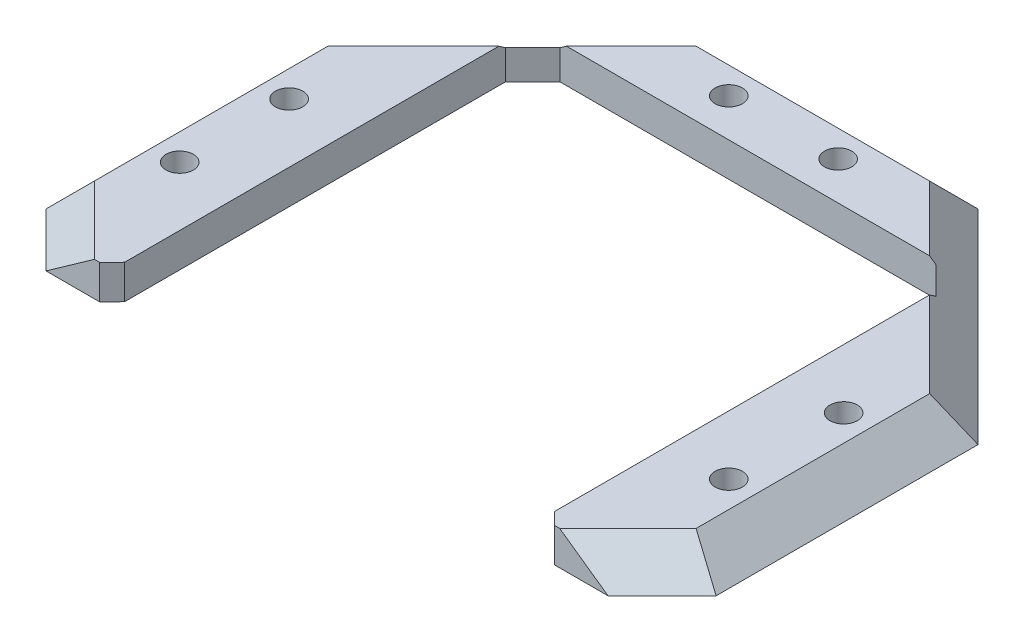
ISO-10303-21;
HEADER;
FILE_DESCRIPTION(('STEP AP214'),'2;1');
FILE_NAME('part.step','',(''),(''),'','','');
FILE_SCHEMA(('AUTOMOTIVE_DESIGN { 1 0 10303 214 1 1 1 1 }'));
ENDSEC;
DATA;
#1=APPLICATION_CONTEXT('core data for automotive mechanical design processes');
#2=APPLICATION_PROTOCOL_DEFINITION('international standard','automotive_design',2000,#1);
#3=PRODUCT_CONTEXT('',#1,'mechanical');
#4=PRODUCT('Part','Part','',(#3));
#5=PRODUCT_RELATED_PRODUCT_CATEGORY('part','',(#4));
#6=PRODUCT_DEFINITION_FORMATION('','',#4);
#7=PRODUCT_DEFINITION_CONTEXT('part definition',#1,'design');
#8=PRODUCT_DEFINITION('design','',#6,#7);
#9=PRODUCT_DEFINITION_SHAPE('','',#8);
#10=(LENGTH_UNIT() NAMED_UNIT(*) SI_UNIT(.MILLI.,.METRE.));
#11=(NAMED_UNIT(*) PLANE_ANGLE_UNIT() SI_UNIT($,.RADIAN.));
#12=(NAMED_UNIT(*) SI_UNIT($,.STERADIAN.) SOLID_ANGLE_UNIT());
#13=UNCERTAINTY_MEASURE_WITH_UNIT(LENGTH_MEASURE(1.E-05),#10,'distance_accuracy_value','');
#14=(GEOMETRIC_REPRESENTATION_CONTEXT(3) GLOBAL_UNCERTAINTY_ASSIGNED_CONTEXT((#13)) GLOBAL_UNIT_ASSIGNED_CONTEXT((#10,
#11,#12)) REPRESENTATION_CONTEXT('',''));
#15=CARTESIAN_POINT('',(0.,0.,0.));
#16=DIRECTION('',(0.,0.,1.));
#17=DIRECTION('',(1.,0.,0.));
#18=AXIS2_PLACEMENT_3D('',#15,#16,#17);
#19=CARTESIAN_POINT('',(0.,5.,0.));
#20=DIRECTION('',(0.,1.,0.));
#21=DIRECTION('',(0.,0.,1.));
#22=AXIS2_PLACEMENT_3D('',#19,#20,#21);
#23=PLANE('',#22);
#24=CARTESIAN_POINT('',(-19.742793914786,5.,42.5338369360824));
#25=DIRECTION('',(0.,1.,0.));
#26=DIRECTION('',(0.,0.,1.));
#27=AXIS2_PLACEMENT_3D('',#24,#25,#26);
#28=CIRCLE('',#27,2.);
#29=CARTESIAN_POINT('',(-19.742793914786,5.,44.5338369360824));
#30=VERTEX_POINT('',#29);
#31=EDGE_CURVE('E332',#30,#30,#28,.T.);
#32=ORIENTED_EDGE('',*,*,#31,.F.);
#33=EDGE_LOOP('',(#32));
#34=FACE_BOUND('',#33,.T.);
#35=CARTESIAN_POINT('',(-19.742793914786,5.,58.5338369360824));
#36=DIRECTION('',(0.,1.,0.));
#37=DIRECTION('',(0.,0.,1.));
#38=AXIS2_PLACEMENT_3D('',#35,#36,#37);
#39=CIRCLE('',#38,2.);
#40=CARTESIAN_POINT('',(-19.742793914786,5.,60.5338369360824));
#41=VERTEX_POINT('',#40);
#42=EDGE_CURVE('E331',#41,#41,#39,.T.);
#43=ORIENTED_EDGE('',*,*,#42,.F.);
#44=EDGE_LOOP('',(#43));
#45=FACE_BOUND('',#44,.T.);
#46=DIRECTION('',(0.,0.,1.));
#47=VECTOR('',#46,1.);
#48=CARTESIAN_POINT('',(-23.5928063283336,5.,69.2338369360829));
#49=LINE('',#48,#47);
#50=CARTESIAN_POINT('',(-23.5928063283336,5.,33.0049047479484));
#51=VERTEX_POINT('',#50);
#52=CARTESIAN_POINT('',(-23.5928063283336,5.,67.1627691242174));
#53=VERTEX_POINT('',#52);
#54=EDGE_CURVE('E271',#51,#53,#49,.T.);
#55=ORIENTED_EDGE('',*,*,#54,.T.);
#56=DIRECTION('',(0.707106781186548,0.,0.707106781186547));
#57=VECTOR('',#56,1.);
#58=CARTESIAN_POINT('',(-17.2072724224004,5.,73.5483030301506));
#59=LINE('',#58,#57);
#60=CARTESIAN_POINT('',(-13.6717385164677,5.,77.0838369360834));
#61=VERTEX_POINT('',#60);
#62=EDGE_CURVE('E273',#53,#61,#59,.T.);
#63=ORIENTED_EDGE('',*,*,#62,.T.);
#64=DIRECTION('',(1.,0.,0.));
#65=VECTOR('',#64,1.);
#66=CARTESIAN_POINT('',(-12.8828063283335,5.,77.0838369360834));
#67=LINE('',#66,#65);
#68=CARTESIAN_POINT('',(-12.8828063283335,5.,77.0838369360834));
#69=VERTEX_POINT('',#68);
#70=EDGE_CURVE('E192',#61,#69,#67,.T.);
#71=ORIENTED_EDGE('',*,*,#70,.T.);
#72=DIRECTION('',(0.695356713919739,0.,-0.718664762185223));
#73=VECTOR('',#72,1.);
#74=CARTESIAN_POINT('',(-11.0928063283336,5.,75.2338369309638));
#75=LINE('',#74,#73);
#76=CARTESIAN_POINT('',(-11.0928063283336,5.,75.2338369309638));
#77=VERTEX_POINT('',#76);
#78=EDGE_CURVE('E197',#69,#77,#75,.T.);
#79=ORIENTED_EDGE('',*,*,#78,.T.);
#80=DIRECTION('',(0.,0.,-1.));
#81=VECTOR('',#80,1.);
#82=CARTESIAN_POINT('',(-11.0928063283336,5.,75.2338369309638));
#83=LINE('',#82,#81);
#84=CARTESIAN_POINT('',(-11.0928063283336,5.,20.5049047479484));
#85=VERTEX_POINT('',#84);
#86=EDGE_CURVE('E243',#77,#85,#83,.T.);
#87=ORIENTED_EDGE('',*,*,#86,.T.);
#88=DIRECTION('',(-0.707106781186549,0.,0.707106781186546));
#89=VECTOR('',#88,1.);
#90=CARTESIAN_POINT('',(-25.0572724224009,5.,34.4693708420157));
#91=LINE('',#90,#89);
#92=EDGE_CURVE('E269',#85,#51,#91,.T.);
#93=ORIENTED_EDGE('',*,*,#92,.T.);
#94=EDGE_LOOP('',(#55,#63,#71,#79,#87,#93));
#95=FACE_BOUND('',#94,.T.);
#96=ADVANCED_FACE('F39',(#34,#45,#95),#23,.T.);
#97=CARTESIAN_POINT('',(28.0072060852122,5.,9.98383693607138));
#98=DIRECTION('',(0.,1.,0.));
#99=DIRECTION('',(0.,0.,1.));
#100=AXIS2_PLACEMENT_3D('',#97,#98,#99);
#101=CIRCLE('',#100,2.);
#102=CARTESIAN_POINT('',(28.0072060852122,5.,11.9838369360714));
#103=VERTEX_POINT('',#102);
#104=EDGE_CURVE('E303',#103,#103,#101,.T.);
#105=ORIENTED_EDGE('',*,*,#104,.F.);
#106=EDGE_LOOP('',(#105));
#107=FACE_BOUND('',#106,.T.);
#108=CARTESIAN_POINT('',(12.0072060852122,5.,9.98383693607155));
#109=DIRECTION('',(0.,1.,0.));
#110=DIRECTION('',(0.,0.,1.));
#111=AXIS2_PLACEMENT_3D('',#108,#109,#110);
#112=CIRCLE('',#111,2.);
#113=CARTESIAN_POINT('',(12.0072060852122,5.,11.9838369360715));
#114=VERTEX_POINT('',#113);
#115=EDGE_CURVE('E313',#114,#114,#112,.T.);
#116=ORIENTED_EDGE('',*,*,#115,.F.);
#117=EDGE_LOOP('',(#116));
#118=FACE_BOUND('',#117,.T.);
#119=DIRECTION('',(-1.,0.,0.));
#120=VECTOR('',#119,1.);
#121=CARTESIAN_POINT('',(1.25720608521173,5.,6.08382452253759));
#122=LINE('',#121,#120);
#123=CARTESIAN_POINT('',(37.4861382733464,5.,6.08382452253746));
#124=VERTEX_POINT('',#123);
#125=CARTESIAN_POINT('',(3.32827389707727,5.,6.08382452253758));
#126=VERTEX_POINT('',#125);
#127=EDGE_CURVE('E265',#124,#126,#122,.T.);
#128=ORIENTED_EDGE('',*,*,#127,.T.);
#129=DIRECTION('',(-0.707106781186549,0.,0.707106781186546));
#130=VECTOR('',#129,1.);
#131=CARTESIAN_POINT('',(-25.0572724224009,5.,34.4693708420157));
#132=LINE('',#131,#130);
#133=CARTESIAN_POINT('',(-6.14694024024418,5.,15.559038659859));
#134=VERTEX_POINT('',#133);
#135=EDGE_CURVE('E267',#126,#134,#132,.T.);
#136=ORIENTED_EDGE('',*,*,#135,.T.);
#137=DIRECTION('',(1.,0.,0.));
#138=VECTOR('',#137,1.);
#139=CARTESIAN_POINT('',(47.9072184987533,5.,15.559038659859));
#140=LINE('',#139,#138);
#141=CARTESIAN_POINT('',(46.9613524106679,5.,15.559038659859));
#142=VERTEX_POINT('',#141);
#143=EDGE_CURVE('E175',#134,#142,#140,.T.);
#144=ORIENTED_EDGE('',*,*,#143,.T.);
#145=DIRECTION('',(-0.707106781186548,0.,-0.707106781186548));
#146=VECTOR('',#145,1.);
#147=CARTESIAN_POINT('',(36.0216721792791,5.,4.61935842847021));
#148=LINE('',#147,#146);
#149=EDGE_CURVE('E263',#142,#124,#148,.T.);
#150=ORIENTED_EDGE('',*,*,#149,.T.);
#151=EDGE_LOOP('',(#128,#136,#144,#150));
#152=FACE_BOUND('',#151,.T.);
#153=ADVANCED_FACE('F349',(#107,#118,#152),#23,.T.);
#154=CARTESIAN_POINT('',(-11.0928063283336,5.,75.2338369309638));
#155=DIRECTION('',(-1.,0.,0.));
#156=DIRECTION('',(0.,0.,1.));
#157=AXIS2_PLACEMENT_3D('',#154,#155,#156);
#158=PLANE('',#157);
#159=DIRECTION('',(0.,-1.,0.));
#160=VECTOR('',#159,1.);
#161=CARTESIAN_POINT('',(-11.0928063283336,5.,19.5590386598594));
#162=LINE('',#161,#160);
#163=CARTESIAN_POINT('',(-11.0928063283336,4.33117167501787,19.5590386598594));
#164=VERTEX_POINT('',#163);
#165=CARTESIAN_POINT('',(-11.0928063283336,0.,19.5590386598594));
#166=VERTEX_POINT('',#165);
#167=EDGE_CURVE('E255',#164,#166,#162,.T.);
#168=ORIENTED_EDGE('',*,*,#167,.F.);
#169=DIRECTION('',(0.,0.577350269189627,0.816496580927725));
#170=VECTOR('',#169,1.);
#171=CARTESIAN_POINT('',(-11.0928063283336,-2.4476519240041,9.9723343891878));
#172=LINE('',#171,#170);
#173=EDGE_CURVE('E284',#164,#85,#172,.T.);
#174=ORIENTED_EDGE('',*,*,#173,.T.);
#175=ORIENTED_EDGE('',*,*,#86,.F.);
#176=DIRECTION('',(0.,-1.,0.));
#177=VECTOR('',#176,1.);
#178=CARTESIAN_POINT('',(-11.0928063283336,5.,75.2338369309638));
#179=LINE('',#178,#177);
#180=CARTESIAN_POINT('',(-11.0928063283336,0.,75.2338369309638));
#181=VERTEX_POINT('',#180);
#182=EDGE_CURVE('E199',#77,#181,#179,.T.);
#183=ORIENTED_EDGE('',*,*,#182,.T.);
#184=DIRECTION('',(0.,0.,-1.));
#185=VECTOR('',#184,1.);
#186=CARTESIAN_POINT('',(-11.0928063283336,0.,75.2338369309638));
#187=LINE('',#186,#185);
#188=EDGE_CURVE('E200',#181,#166,#187,.T.);
#189=ORIENTED_EDGE('',*,*,#188,.T.);
#190=EDGE_LOOP('',(#168,#174,#175,#183,#189));
#191=FACE_BOUND('',#190,.T.);
#192=ADVANCED_FACE('F407',(#191),#158,.F.);
#193=CARTESIAN_POINT('',(-7.09280632833321,5.,15.559038659859));
#194=DIRECTION('',(-0.707106781186547,0.,-0.707106781186548));
#195=DIRECTION('',(-0.707106781186548,0.,0.707106781186547));
#196=AXIS2_PLACEMENT_3D('',#193,#194,#195);
#197=PLANE('',#196);
#198=DIRECTION('',(0.,-1.,0.));
#199=VECTOR('',#198,1.);
#200=CARTESIAN_POINT('',(-7.09280632833321,5.,15.559038659859));
#201=LINE('',#200,#199);
#202=CARTESIAN_POINT('',(-7.09280632833321,4.33117167501786,15.559038659859));
#203=VERTEX_POINT('',#202);
#204=CARTESIAN_POINT('',(-7.09280632833321,0.,15.559038659859));
#205=VERTEX_POINT('',#204);
#206=EDGE_CURVE('E253',#203,#205,#201,.T.);
#207=ORIENTED_EDGE('',*,*,#206,.F.);
#208=DIRECTION('',(-0.707106781186548,0.,0.707106781186547));
#209=VECTOR('',#208,1.);
#210=CARTESIAN_POINT('',(4.23311616576289,4.33117167501783,4.23311616576291));
#211=LINE('',#210,#209);
#212=EDGE_CURVE('E64',#203,#164,#211,.T.);
#213=ORIENTED_EDGE('',*,*,#212,.T.);
#214=ORIENTED_EDGE('',*,*,#167,.T.);
#215=DIRECTION('',(0.707106781186548,0.,-0.707106781186547));
#216=VECTOR('',#215,1.);
#217=CARTESIAN_POINT('',(-7.09280632833321,0.,15.559038659859));
#218=LINE('',#217,#216);
#219=EDGE_CURVE('E203',#166,#205,#218,.T.);
#220=ORIENTED_EDGE('',*,*,#219,.T.);
#221=EDGE_LOOP('',(#207,#213,#214,#220));
#222=FACE_BOUND('',#221,.T.);
#223=ADVANCED_FACE('F366',(#222),#197,.F.);
#224=CARTESIAN_POINT('',(47.9072184987533,5.,15.559038659859));
#225=DIRECTION('',(0.,0.,-1.));
#226=DIRECTION('',(-1.,0.,0.));
#227=AXIS2_PLACEMENT_3D('',#224,#225,#226);
#228=PLANE('',#227);
#229=ORIENTED_EDGE('',*,*,#143,.F.);
#230=DIRECTION('',(-0.816496580927726,-0.577350269189626,0.));
#231=VECTOR('',#230,1.);
#232=CARTESIAN_POINT('',(1.08838605979022,10.1161482908517,15.559038659859));
#233=LINE('',#232,#231);
#234=EDGE_CURVE('E281',#134,#203,#233,.T.);
#235=ORIENTED_EDGE('',*,*,#234,.T.);
#236=ORIENTED_EDGE('',*,*,#206,.T.);
#237=DIRECTION('',(1.,0.,0.));
#238=VECTOR('',#237,1.);
#239=CARTESIAN_POINT('',(47.9072184987533,0.,15.559038659859));
#240=LINE('',#239,#238);
#241=CARTESIAN_POINT('',(47.9072184987533,0.,15.559038659859));
#242=VERTEX_POINT('',#241);
#243=EDGE_CURVE('E207',#205,#242,#240,.T.);
#244=ORIENTED_EDGE('',*,*,#243,.T.);
#245=DIRECTION('',(0.,-1.,0.));
#246=VECTOR('',#245,1.);
#247=CARTESIAN_POINT('',(47.9072184987533,5.,15.559038659859));
#248=LINE('',#247,#246);
#249=CARTESIAN_POINT('',(47.9072184987533,4.33117167502047,15.559038659859));
#250=VERTEX_POINT('',#249);
#251=EDGE_CURVE('E251',#250,#242,#248,.T.);
#252=ORIENTED_EDGE('',*,*,#251,.F.);
#253=DIRECTION('',(-0.816496580927726,0.577350269189627,0.));
#254=VECTOR('',#253,1.);
#255=CARTESIAN_POINT('',(26.1212220538256,19.7361974961348,15.559038659859));
#256=LINE('',#255,#254);
#257=EDGE_CURVE('E279',#250,#142,#256,.T.);
#258=ORIENTED_EDGE('',*,*,#257,.T.);
#259=EDGE_LOOP('',(#229,#235,#236,#244,#252,#258));
#260=FACE_BOUND('',#259,.T.);
#261=ADVANCED_FACE('F365',(#260),#228,.F.);
#262=CARTESIAN_POINT('',(51.9072184987533,5.,19.5590386598594));
#263=DIRECTION('',(0.707106781186585,0.,-0.70710678118651));
#264=DIRECTION('',(-0.70710678118651,0.,-0.707106781186585));
#265=AXIS2_PLACEMENT_3D('',#262,#263,#264);
#266=PLANE('',#265);
#267=DIRECTION('',(0.,-1.,0.));
#268=VECTOR('',#267,1.);
#269=CARTESIAN_POINT('',(51.9072184987533,5.,19.5590386598594));
#270=LINE('',#269,#268);
#271=CARTESIAN_POINT('',(51.9072184987533,4.33117167502077,19.5590386598594));
#272=VERTEX_POINT('',#271);
#273=CARTESIAN_POINT('',(51.9072184987533,0.,19.5590386598594));
#274=VERTEX_POINT('',#273);
#275=EDGE_CURVE('E184',#272,#274,#270,.T.);
#276=ORIENTED_EDGE('',*,*,#275,.F.);
#277=DIRECTION('',(-0.70710678118651,0.,-0.707106781186585));
#278=VECTOR('',#277,1.);
#279=CARTESIAN_POINT('',(16.1740899194489,4.33117167501809,-16.1740899194488));
#280=LINE('',#279,#278);
#281=EDGE_CURVE('E11',#272,#250,#280,.T.);
#282=ORIENTED_EDGE('',*,*,#281,.T.);
#283=ORIENTED_EDGE('',*,*,#251,.T.);
#284=DIRECTION('',(0.70710678118651,0.,0.707106781186585));
#285=VECTOR('',#284,1.);
#286=CARTESIAN_POINT('',(51.9072184987533,0.,19.5590386598594));
#287=LINE('',#286,#285);
#288=EDGE_CURVE('E210',#242,#274,#287,.T.);
#289=ORIENTED_EDGE('',*,*,#288,.T.);
#290=EDGE_LOOP('',(#276,#282,#283,#289));
#291=FACE_BOUND('',#290,.T.);
#292=ADVANCED_FACE('F375',(#291),#266,.F.);
#293=CARTESIAN_POINT('',(51.9072184987533,5.,75.3938369360732));
#294=DIRECTION('',(1.,0.,0.));
#295=DIRECTION('',(0.,0.,-1.));
#296=AXIS2_PLACEMENT_3D('',#293,#294,#295);
#297=PLANE('',#296);
#298=DIRECTION('',(0.,0.,1.));
#299=VECTOR('',#298,1.);
#300=CARTESIAN_POINT('',(51.9072184987533,5.,75.3938369360732));
#301=LINE('',#300,#299);
#302=CARTESIAN_POINT('',(51.9072184987533,5.,20.5049047479444));
#303=VERTEX_POINT('',#302);
#304=CARTESIAN_POINT('',(51.9072184987533,5.,75.3938369360732));
#305=VERTEX_POINT('',#304);
#306=EDGE_CURVE('E165',#303,#305,#301,.T.);
#307=ORIENTED_EDGE('',*,*,#306,.F.);
#308=DIRECTION('',(0.,-0.577350269189626,-0.816496580927726));
#309=VECTOR('',#308,1.);
#310=CARTESIAN_POINT('',(51.9072184987533,-12.0677011292853,-3.6324696676215));
#311=LINE('',#310,#309);
#312=EDGE_CURVE('E49',#303,#272,#311,.T.);
#313=ORIENTED_EDGE('',*,*,#312,.T.);
#314=ORIENTED_EDGE('',*,*,#275,.T.);
#315=DIRECTION('',(0.,0.,1.));
#316=VECTOR('',#315,1.);
#317=CARTESIAN_POINT('',(51.9072184987533,0.,75.3938369360732));
#318=LINE('',#317,#316);
#319=CARTESIAN_POINT('',(51.9072184987533,0.,75.3938369360732));
#320=VERTEX_POINT('',#319);
#321=EDGE_CURVE('E181',#274,#320,#318,.T.);
#322=ORIENTED_EDGE('',*,*,#321,.T.);
#323=DIRECTION('',(0.,-1.,0.));
#324=VECTOR('',#323,1.);
#325=CARTESIAN_POINT('',(51.9072184987533,5.,75.3938369360732));
#326=LINE('',#325,#324);
#327=EDGE_CURVE('E178',#305,#320,#326,.T.);
#328=ORIENTED_EDGE('',*,*,#327,.F.);
#329=EDGE_LOOP('',(#307,#313,#314,#322,#328));
#330=FACE_BOUND('',#329,.T.);
#331=ADVANCED_FACE('F179',(#330),#297,.F.);
#332=CARTESIAN_POINT('',(53.6472184987528,5.,77.1338369360727));
#333=DIRECTION('',(0.707106781186548,0.,-0.707106781186548));
#334=DIRECTION('',(-0.707106781186548,0.,-0.707106781186548));
#335=AXIS2_PLACEMENT_3D('',#332,#333,#334);
#336=PLANE('',#335);
#337=DIRECTION('',(0.707106781186548,0.,0.707106781186548));
#338=VECTOR('',#337,1.);
#339=CARTESIAN_POINT('',(53.6472184987528,0.,77.1338369360727));
#340=LINE('',#339,#338);
#341=CARTESIAN_POINT('',(53.6472184987528,0.,77.1338369360727));
#342=VERTEX_POINT('',#341);
#343=EDGE_CURVE('E214',#320,#342,#340,.T.);
#344=ORIENTED_EDGE('',*,*,#343,.T.);
#345=DIRECTION('',(0.,-1.,0.));
#346=VECTOR('',#345,1.);
#347=CARTESIAN_POINT('',(53.6472184987528,5.,77.1338369360727));
#348=LINE('',#347,#346);
#349=CARTESIAN_POINT('',(53.6472184987528,5.,77.1338369360727));
#350=VERTEX_POINT('',#349);
#351=EDGE_CURVE('E185',#350,#342,#348,.T.);
#352=ORIENTED_EDGE('',*,*,#351,.F.);
#353=DIRECTION('',(0.707106781186548,0.,0.707106781186548));
#354=VECTOR('',#353,1.);
#355=CARTESIAN_POINT('',(53.6472184987528,5.,77.1338369360727));
#356=LINE('',#355,#354);
#357=EDGE_CURVE('E171',#305,#350,#356,.T.);
#358=ORIENTED_EDGE('',*,*,#357,.F.);
#359=ORIENTED_EDGE('',*,*,#327,.T.);
#360=EDGE_LOOP('',(#344,#352,#358,#359));
#361=FACE_BOUND('',#360,.T.);
#362=ADVANCED_FACE('F187',(#361),#336,.F.);
#363=CARTESIAN_POINT('',(61.5072184987525,5.,77.1338369360727));
#364=DIRECTION('',(0.,0.,-1.));
#365=DIRECTION('',(-1.,0.,0.));
#366=AXIS2_PLACEMENT_3D('',#363,#364,#365);
#367=PLANE('',#366);
#368=DIRECTION('',(1.,0.,0.));
#369=VECTOR('',#368,1.);
#370=CARTESIAN_POINT('',(61.5072184987525,0.,77.1338369360727));
#371=LINE('',#370,#369);
#372=CARTESIAN_POINT('',(61.5072184987525,0.,77.1338369360727));
#373=VERTEX_POINT('',#372);
#374=EDGE_CURVE('E216',#342,#373,#371,.T.);
#375=ORIENTED_EDGE('',*,*,#374,.T.);
#376=DIRECTION('',(-0.816496580927726,0.577350269189626,0.));
#377=VECTOR('',#376,1.);
#378=CARTESIAN_POINT('',(62.0020461032822,-0.349895954681249,77.1338369360727));
#379=LINE('',#378,#377);
#380=CARTESIAN_POINT('',(54.436150686887,5.,77.1338369360727));
#381=VERTEX_POINT('',#380);
#382=EDGE_CURVE('E275',#373,#381,#379,.T.);
#383=ORIENTED_EDGE('',*,*,#382,.T.);
#384=DIRECTION('',(1.,0.,0.));
#385=VECTOR('',#384,1.);
#386=CARTESIAN_POINT('',(61.5072184987525,5.,77.1338369360727));
#387=LINE('',#386,#385);
#388=EDGE_CURVE('E190',#350,#381,#387,.T.);
#389=ORIENTED_EDGE('',*,*,#388,.F.);
#390=ORIENTED_EDGE('',*,*,#351,.T.);
#391=EDGE_LOOP('',(#375,#383,#389,#390));
#392=FACE_BOUND('',#391,.T.);
#393=ADVANCED_FACE('F387',(#392),#367,.F.);
#394=CARTESIAN_POINT('',(-12.8828063283335,5.,77.0838369360834));
#395=DIRECTION('',(0.,0.,-1.));
#396=DIRECTION('',(-1.,0.,0.));
#397=AXIS2_PLACEMENT_3D('',#394,#395,#396);
#398=PLANE('',#397);
#399=ORIENTED_EDGE('',*,*,#70,.F.);
#400=DIRECTION('',(-0.816496580927726,-0.577350269189626,0.));
#401=VECTOR('',#400,1.);
#402=CARTESIAN_POINT('',(-34.8091046563396,-9.94637493392633,77.0838369360834));
#403=LINE('',#402,#401);
#404=CARTESIAN_POINT('',(-20.7428063283332,0.,77.0838369360834));
#405=VERTEX_POINT('',#404);
#406=EDGE_CURVE('E277',#61,#405,#403,.T.);
#407=ORIENTED_EDGE('',*,*,#406,.T.);
#408=DIRECTION('',(1.,0.,0.));
#409=VECTOR('',#408,1.);
#410=CARTESIAN_POINT('',(-12.8828063283335,0.,77.0838369360834));
#411=LINE('',#410,#409);
#412=CARTESIAN_POINT('',(-12.8828063283335,0.,77.0838369360834));
#413=VERTEX_POINT('',#412);
#414=EDGE_CURVE('E239',#405,#413,#411,.T.);
#415=ORIENTED_EDGE('',*,*,#414,.T.);
#416=DIRECTION('',(0.,-1.,0.));
#417=VECTOR('',#416,1.);
#418=CARTESIAN_POINT('',(-12.8828063283335,5.,77.0838369360834));
#419=LINE('',#418,#417);
#420=EDGE_CURVE('E246',#69,#413,#419,.T.);
#421=ORIENTED_EDGE('',*,*,#420,.F.);
#422=EDGE_LOOP('',(#399,#407,#415,#421));
#423=FACE_BOUND('',#422,.T.);
#424=ADVANCED_FACE('F389',(#423),#398,.F.);
#425=CARTESIAN_POINT('',(-11.0928063283336,5.,75.2338369309638));
#426=DIRECTION('',(-0.718664762185223,0.,-0.695356713919739));
#427=DIRECTION('',(-0.695356713919739,0.,0.718664762185223));
#428=AXIS2_PLACEMENT_3D('',#425,#426,#427);
#429=PLANE('',#428);
#430=DIRECTION('',(0.695356713919739,0.,-0.718664762185223));
#431=VECTOR('',#430,1.);
#432=CARTESIAN_POINT('',(-11.0928063283336,0.,75.2338369309638));
#433=LINE('',#432,#431);
#434=EDGE_CURVE('E241',#413,#181,#433,.T.);
#435=ORIENTED_EDGE('',*,*,#434,.T.);
#436=ORIENTED_EDGE('',*,*,#182,.F.);
#437=ORIENTED_EDGE('',*,*,#78,.F.);
#438=ORIENTED_EDGE('',*,*,#420,.T.);
#439=EDGE_LOOP('',(#435,#436,#437,#438));
#440=FACE_BOUND('',#439,.T.);
#441=ADVANCED_FACE('F395',(#440),#429,.F.);
#442=ORIENTED_EDGE('',*,*,#388,.T.);
#443=DIRECTION('',(0.707106781186548,0.,-0.707106781186547));
#444=VECTOR('',#443,1.);
#445=CARTESIAN_POINT('',(65.8716845928206,5.,65.6983030301392));
#446=LINE('',#445,#444);
#447=CARTESIAN_POINT('',(64.4072184987533,5.,67.1627691242065));
#448=VERTEX_POINT('',#447);
#449=EDGE_CURVE('E260',#381,#448,#446,.T.);
#450=ORIENTED_EDGE('',*,*,#449,.T.);
#451=DIRECTION('',(0.,0.,-1.));
#452=VECTOR('',#451,1.);
#453=CARTESIAN_POINT('',(64.4072184987533,5.,30.9338369360792));
#454=LINE('',#453,#452);
#455=CARTESIAN_POINT('',(64.4072184987533,5.,33.0049047479444));
#456=VERTEX_POINT('',#455);
#457=EDGE_CURVE('E257',#448,#456,#454,.T.);
#458=ORIENTED_EDGE('',*,*,#457,.T.);
#459=DIRECTION('',(-0.707106781186548,0.,-0.707106781186548));
#460=VECTOR('',#459,1.);
#461=CARTESIAN_POINT('',(36.0216721792791,5.,4.61935842847021));
#462=LINE('',#461,#460);
#463=EDGE_CURVE('E174',#456,#303,#462,.T.);
#464=ORIENTED_EDGE('',*,*,#463,.T.);
#465=ORIENTED_EDGE('',*,*,#306,.T.);
#466=ORIENTED_EDGE('',*,*,#357,.T.);
#467=EDGE_LOOP('',(#442,#450,#458,#464,#465,#466));
#468=FACE_BOUND('',#467,.T.);
#469=CARTESIAN_POINT('',(60.5572060852099,5.,58.5338369360727));
#470=DIRECTION('',(0.,1.,0.));
#471=DIRECTION('',(0.,0.,1.));
#472=AXIS2_PLACEMENT_3D('',#469,#470,#471);
#473=CIRCLE('',#472,2.00000000000001);
#474=CARTESIAN_POINT('',(60.5572060852099,5.,60.5338369360727));
#475=VERTEX_POINT('',#474);
#476=EDGE_CURVE('E320',#475,#475,#473,.T.);
#477=ORIENTED_EDGE('',*,*,#476,.F.);
#478=EDGE_LOOP('',(#477));
#479=FACE_BOUND('',#478,.T.);
#480=CARTESIAN_POINT('',(60.5572060852092,5.,41.733836936073));
#481=DIRECTION('',(0.,1.,0.));
#482=DIRECTION('',(0.,0.,1.));
#483=AXIS2_PLACEMENT_3D('',#480,#481,#482);
#484=CIRCLE('',#483,2.);
#485=CARTESIAN_POINT('',(60.5572060852092,5.,43.733836936073));
#486=VERTEX_POINT('',#485);
#487=EDGE_CURVE('E319',#486,#486,#484,.T.);
#488=ORIENTED_EDGE('',*,*,#487,.F.);
#489=EDGE_LOOP('',(#488));
#490=FACE_BOUND('',#489,.T.);
#491=ADVANCED_FACE('F168',(#468,#479,#490),#23,.T.);
#492=CARTESIAN_POINT('',(0.,0.,0.));
#493=DIRECTION('',(0.,1.,0.));
#494=DIRECTION('',(0.,0.,1.));
#495=AXIS2_PLACEMENT_3D('',#492,#493,#494);
#496=PLANE('',#495);
#497=CARTESIAN_POINT('',(12.0072060852122,0.,9.98383693607155));
#498=DIRECTION('',(0.,1.,0.));
#499=DIRECTION('',(0.,0.,1.));
#500=AXIS2_PLACEMENT_3D('',#497,#498,#499);
#501=CIRCLE('',#500,2.);
#502=CARTESIAN_POINT('',(12.0072060852122,0.,11.9838369360715));
#503=VERTEX_POINT('',#502);
#504=EDGE_CURVE('E323',#503,#503,#501,.T.);
#505=ORIENTED_EDGE('',*,*,#504,.T.);
#506=EDGE_LOOP('',(#505));
#507=FACE_BOUND('',#506,.T.);
#508=CARTESIAN_POINT('',(60.5572060852099,0.,58.5338369360727));
#509=DIRECTION('',(0.,1.,0.));
#510=DIRECTION('',(0.,0.,1.));
#511=AXIS2_PLACEMENT_3D('',#508,#509,#510);
#512=CIRCLE('',#511,2.00000000000001);
#513=CARTESIAN_POINT('',(60.5572060852099,0.,60.5338369360727));
#514=VERTEX_POINT('',#513);
#515=EDGE_CURVE('E316',#514,#514,#512,.T.);
#516=ORIENTED_EDGE('',*,*,#515,.T.);
#517=EDGE_LOOP('',(#516));
#518=FACE_BOUND('',#517,.T.);
#519=CARTESIAN_POINT('',(60.5572060852092,0.,41.733836936073));
#520=DIRECTION('',(0.,1.,0.));
#521=DIRECTION('',(0.,0.,1.));
#522=AXIS2_PLACEMENT_3D('',#519,#520,#521);
#523=CIRCLE('',#522,2.);
#524=CARTESIAN_POINT('',(60.5572060852092,0.,43.733836936073));
#525=VERTEX_POINT('',#524);
#526=EDGE_CURVE('E335',#525,#525,#523,.T.);
#527=ORIENTED_EDGE('',*,*,#526,.T.);
#528=EDGE_LOOP('',(#527));
#529=FACE_BOUND('',#528,.T.);
#530=CARTESIAN_POINT('',(-19.742793914786,0.,42.5338369360824));
#531=DIRECTION('',(0.,1.,0.));
#532=DIRECTION('',(0.,0.,1.));
#533=AXIS2_PLACEMENT_3D('',#530,#531,#532);
#534=CIRCLE('',#533,2.);
#535=CARTESIAN_POINT('',(-19.742793914786,0.,44.5338369360824));
#536=VERTEX_POINT('',#535);
#537=EDGE_CURVE('E328',#536,#536,#534,.T.);
#538=ORIENTED_EDGE('',*,*,#537,.T.);
#539=EDGE_LOOP('',(#538));
#540=FACE_BOUND('',#539,.T.);
#541=CARTESIAN_POINT('',(28.0072060852122,0.,9.98383693607138));
#542=DIRECTION('',(0.,1.,0.));
#543=DIRECTION('',(0.,0.,1.));
#544=AXIS2_PLACEMENT_3D('',#541,#542,#543);
#545=CIRCLE('',#544,2.);
#546=CARTESIAN_POINT('',(28.0072060852122,0.,11.9838369360714));
#547=VERTEX_POINT('',#546);
#548=EDGE_CURVE('E308',#547,#547,#545,.T.);
#549=ORIENTED_EDGE('',*,*,#548,.T.);
#550=EDGE_LOOP('',(#549));
#551=FACE_BOUND('',#550,.T.);
#552=CARTESIAN_POINT('',(-19.742793914786,0.,58.5338369360824));
#553=DIRECTION('',(0.,1.,0.));
#554=DIRECTION('',(0.,0.,1.));
#555=AXIS2_PLACEMENT_3D('',#552,#553,#554);
#556=CIRCLE('',#555,2.);
#557=CARTESIAN_POINT('',(-19.742793914786,0.,60.5338369360824));
#558=VERTEX_POINT('',#557);
#559=EDGE_CURVE('E204',#558,#558,#556,.T.);
#560=ORIENTED_EDGE('',*,*,#559,.T.);
#561=EDGE_LOOP('',(#560));
#562=FACE_BOUND('',#561,.T.);
#563=ORIENTED_EDGE('',*,*,#188,.F.);
#564=ORIENTED_EDGE('',*,*,#434,.F.);
#565=ORIENTED_EDGE('',*,*,#414,.F.);
#566=DIRECTION('',(0.707106781186548,0.,0.707106781186547));
#567=VECTOR('',#566,1.);
#568=CARTESIAN_POINT('',(-20.7428063283332,0.,77.0838369360834));
#569=LINE('',#568,#567);
#570=CARTESIAN_POINT('',(-28.5928063283336,0.,69.2338369360829));
#571=VERTEX_POINT('',#570);
#572=EDGE_CURVE('E236',#571,#405,#569,.T.);
#573=ORIENTED_EDGE('',*,*,#572,.F.);
#574=DIRECTION('',(0.,0.,1.));
#575=VECTOR('',#574,1.);
#576=CARTESIAN_POINT('',(-28.5928063283336,0.,69.2338369360829));
#577=LINE('',#576,#575);
#578=CARTESIAN_POINT('',(-28.5928063283336,0.,30.9338369360829));
#579=VERTEX_POINT('',#578);
#580=EDGE_CURVE('E233',#579,#571,#577,.T.);
#581=ORIENTED_EDGE('',*,*,#580,.F.);
#582=DIRECTION('',(-0.707106781186549,0.,0.707106781186546));
#583=VECTOR('',#582,1.);
#584=CARTESIAN_POINT('',(-28.5928063283336,0.,30.9338369360829));
#585=LINE('',#584,#583);
#586=CARTESIAN_POINT('',(1.25720608521171,0.,1.0838245225376));
#587=VERTEX_POINT('',#586);
#588=EDGE_CURVE('E230',#587,#579,#585,.T.);
#589=ORIENTED_EDGE('',*,*,#588,.F.);
#590=DIRECTION('',(-1.,0.,0.));
#591=VECTOR('',#590,1.);
#592=CARTESIAN_POINT('',(1.25720608521171,0.,1.0838245225376));
#593=LINE('',#592,#591);
#594=CARTESIAN_POINT('',(39.5572060852119,0.,1.08382452253747));
#595=VERTEX_POINT('',#594);
#596=EDGE_CURVE('E227',#595,#587,#593,.T.);
#597=ORIENTED_EDGE('',*,*,#596,.F.);
#598=DIRECTION('',(-0.707106781186547,0.,-0.707106781186547));
#599=VECTOR('',#598,1.);
#600=CARTESIAN_POINT('',(39.5572060852119,0.,1.08382452253747));
#601=LINE('',#600,#599);
#602=CARTESIAN_POINT('',(69.4072184987533,0.,30.9338369360792));
#603=VERTEX_POINT('',#602);
#604=EDGE_CURVE('E224',#603,#595,#601,.T.);
#605=ORIENTED_EDGE('',*,*,#604,.F.);
#606=DIRECTION('',(0.,0.,-1.));
#607=VECTOR('',#606,1.);
#608=CARTESIAN_POINT('',(69.4072184987533,0.,30.9338369360792));
#609=LINE('',#608,#607);
#610=CARTESIAN_POINT('',(69.4072184987533,0.,69.233836936072));
#611=VERTEX_POINT('',#610);
#612=EDGE_CURVE('E221',#611,#603,#609,.T.);
#613=ORIENTED_EDGE('',*,*,#612,.F.);
#614=DIRECTION('',(0.707106781186548,0.,-0.707106781186547));
#615=VECTOR('',#614,1.);
#616=CARTESIAN_POINT('',(69.4072184987533,0.,69.233836936072));
#617=LINE('',#616,#615);
#618=EDGE_CURVE('E218',#373,#611,#617,.T.);
#619=ORIENTED_EDGE('',*,*,#618,.F.);
#620=ORIENTED_EDGE('',*,*,#374,.F.);
#621=ORIENTED_EDGE('',*,*,#343,.F.);
#622=ORIENTED_EDGE('',*,*,#321,.F.);
#623=ORIENTED_EDGE('',*,*,#288,.F.);
#624=ORIENTED_EDGE('',*,*,#243,.F.);
#625=ORIENTED_EDGE('',*,*,#219,.F.);
#626=EDGE_LOOP('',(#563,#564,#565,#573,#581,#589,#597,#605,#613,#619,#620,#621,#622,#623,#624,#625));
#627=FACE_BOUND('',#626,.T.);
#628=ADVANCED_FACE('F372',(#507,#518,#529,#540,#551,#562,#627),#496,.F.);
#629=CARTESIAN_POINT('',(-19.742793914786,0.,58.5338369360824));
#630=DIRECTION('',(0.,1.,0.));
#631=DIRECTION('',(0.,0.,1.));
#632=AXIS2_PLACEMENT_3D('',#629,#630,#631);
#633=CYLINDRICAL_SURFACE('',#632,2.);
#634=ORIENTED_EDGE('',*,*,#559,.F.);
#635=EDGE_LOOP('',(#634));
#636=FACE_BOUND('',#635,.T.);
#637=ORIENTED_EDGE('',*,*,#42,.T.);
#638=EDGE_LOOP('',(#637));
#639=FACE_BOUND('',#638,.T.);
#640=ADVANCED_FACE('F417',(#636,#639),#633,.F.);
#641=CARTESIAN_POINT('',(28.0072060852122,0.,9.98383693607138));
#642=DIRECTION('',(0.,1.,0.));
#643=DIRECTION('',(0.,0.,1.));
#644=AXIS2_PLACEMENT_3D('',#641,#642,#643);
#645=CYLINDRICAL_SURFACE('',#644,2.);
#646=ORIENTED_EDGE('',*,*,#548,.F.);
#647=EDGE_LOOP('',(#646));
#648=FACE_BOUND('',#647,.T.);
#649=ORIENTED_EDGE('',*,*,#104,.T.);
#650=EDGE_LOOP('',(#649));
#651=FACE_BOUND('',#650,.T.);
#652=ADVANCED_FACE('F599',(#648,#651),#645,.F.);
#653=CARTESIAN_POINT('',(-19.742793914786,0.,42.5338369360824));
#654=DIRECTION('',(0.,1.,0.));
#655=DIRECTION('',(0.,0.,1.));
#656=AXIS2_PLACEMENT_3D('',#653,#654,#655);
#657=CYLINDRICAL_SURFACE('',#656,2.);
#658=ORIENTED_EDGE('',*,*,#537,.F.);
#659=EDGE_LOOP('',(#658));
#660=FACE_BOUND('',#659,.T.);
#661=ORIENTED_EDGE('',*,*,#31,.T.);
#662=EDGE_LOOP('',(#661));
#663=FACE_BOUND('',#662,.T.);
#664=ADVANCED_FACE('F608',(#660,#663),#657,.F.);
#665=CARTESIAN_POINT('',(60.5572060852092,0.,41.733836936073));
#666=DIRECTION('',(0.,1.,0.));
#667=DIRECTION('',(0.,0.,1.));
#668=AXIS2_PLACEMENT_3D('',#665,#666,#667);
#669=CYLINDRICAL_SURFACE('',#668,2.);
#670=ORIENTED_EDGE('',*,*,#526,.F.);
#671=EDGE_LOOP('',(#670));
#672=FACE_BOUND('',#671,.T.);
#673=ORIENTED_EDGE('',*,*,#487,.T.);
#674=EDGE_LOOP('',(#673));
#675=FACE_BOUND('',#674,.T.);
#676=ADVANCED_FACE('F618',(#672,#675),#669,.F.);
#677=CARTESIAN_POINT('',(60.5572060852099,0.,58.5338369360727));
#678=DIRECTION('',(0.,1.,0.));
#679=DIRECTION('',(0.,0.,1.));
#680=AXIS2_PLACEMENT_3D('',#677,#678,#679);
#681=CYLINDRICAL_SURFACE('',#680,2.00000000000001);
#682=ORIENTED_EDGE('',*,*,#515,.F.);
#683=EDGE_LOOP('',(#682));
#684=FACE_BOUND('',#683,.T.);
#685=ORIENTED_EDGE('',*,*,#476,.T.);
#686=EDGE_LOOP('',(#685));
#687=FACE_BOUND('',#686,.T.);
#688=ADVANCED_FACE('F628',(#684,#687),#681,.F.);
#689=CARTESIAN_POINT('',(12.0072060852122,0.,9.98383693607155));
#690=DIRECTION('',(0.,1.,0.));
#691=DIRECTION('',(0.,0.,1.));
#692=AXIS2_PLACEMENT_3D('',#689,#690,#691);
#693=CYLINDRICAL_SURFACE('',#692,2.);
#694=ORIENTED_EDGE('',*,*,#504,.F.);
#695=EDGE_LOOP('',(#694));
#696=FACE_BOUND('',#695,.T.);
#697=ORIENTED_EDGE('',*,*,#115,.T.);
#698=EDGE_LOOP('',(#697));
#699=FACE_BOUND('',#698,.T.);
#700=ADVANCED_FACE('F444',(#696,#699),#693,.F.);
#701=CARTESIAN_POINT('',(-45.3777877262755,5.,45.3777877262756));
#702=DIRECTION('',(-0.5,0.707106781186547,0.5));
#703=DIRECTION('',(-0.707106781186548,0.,-0.707106781186547));
#704=AXIS2_PLACEMENT_3D('',#701,#702,#703);
#705=PLANE('',#704);
#706=ORIENTED_EDGE('',*,*,#406,.F.);
#707=ORIENTED_EDGE('',*,*,#62,.F.);
#708=DIRECTION('',(0.678598344545846,0.678598344545847,-0.281084637714823));
#709=VECTOR('',#708,1.);
#710=CARTESIAN_POINT('',(-10.7819399858755,17.8108663424581,61.8563345394222));
#711=LINE('',#710,#709);
#712=EDGE_CURVE('E44',#571,#53,#711,.T.);
#713=ORIENTED_EDGE('',*,*,#712,.F.);
#714=ORIENTED_EDGE('',*,*,#572,.T.);
#715=EDGE_LOOP('',(#706,#707,#713,#714));
#716=FACE_BOUND('',#715,.T.);
#717=ADVANCED_FACE('F42',(#716),#705,.T.);
#718=CARTESIAN_POINT('',(-23.5928063283336,5.,0.));
#719=DIRECTION('',(-0.707106781186548,0.707106781186546,0.));
#720=DIRECTION('',(0.,0.,-1.));
#721=AXIS2_PLACEMENT_3D('',#718,#719,#720);
#722=PLANE('',#721);
#723=ORIENTED_EDGE('',*,*,#712,.T.);
#724=ORIENTED_EDGE('',*,*,#54,.F.);
#725=DIRECTION('',(0.678598344545846,0.678598344545848,0.281084637714821));
#726=VECTOR('',#725,1.);
#727=CARTESIAN_POINT('',(-15.9591293914413,12.6336769368924,36.1668772659839));
#728=LINE('',#727,#726);
#729=EDGE_CURVE('E297',#579,#51,#728,.T.);
#730=ORIENTED_EDGE('',*,*,#729,.F.);
#731=ORIENTED_EDGE('',*,*,#580,.T.);
#732=EDGE_LOOP('',(#723,#724,#730,#731));
#733=FACE_BOUND('',#732,.T.);
#734=ADVANCED_FACE('F437',(#733),#722,.T.);
#735=CARTESIAN_POINT('',(4.70604920980742,5.,4.70604920980744));
#736=DIRECTION('',(-0.5,0.707106781186547,-0.500000000000001));
#737=DIRECTION('',(0.707106781186549,0.,-0.707106781186546));
#738=AXIS2_PLACEMENT_3D('',#735,#736,#737);
#739=PLANE('',#738);
#740=ORIENTED_EDGE('',*,*,#234,.F.);
#741=ORIENTED_EDGE('',*,*,#135,.F.);
#742=DIRECTION('',(0.281084637714821,0.678598344545848,0.678598344545845));
#743=VECTOR('',#742,1.);
#744=CARTESIAN_POINT('',(3.06531172405464,4.36515315549766,5.44897767803525));
#745=LINE('',#744,#743);
#746=EDGE_CURVE('E295',#587,#126,#745,.T.);
#747=ORIENTED_EDGE('',*,*,#746,.F.);
#748=ORIENTED_EDGE('',*,*,#588,.T.);
#749=ORIENTED_EDGE('',*,*,#729,.T.);
#750=ORIENTED_EDGE('',*,*,#92,.F.);
#751=ORIENTED_EDGE('',*,*,#173,.F.);
#752=ORIENTED_EDGE('',*,*,#212,.F.);
#753=EDGE_LOOP('',(#740,#741,#747,#748,#749,#750,#751,#752));
#754=FACE_BOUND('',#753,.T.);
#755=ADVANCED_FACE('F363',(#754),#739,.T.);
#756=CARTESIAN_POINT('',(0.,5.,6.0838245225376));
#757=DIRECTION('',(0.,0.707106781186546,-0.707106781186548));
#758=DIRECTION('',(1.,0.,0.));
#759=AXIS2_PLACEMENT_3D('',#756,#757,#758);
#760=PLANE('',#759);
#761=ORIENTED_EDGE('',*,*,#746,.T.);
#762=ORIENTED_EDGE('',*,*,#127,.F.);
#763=DIRECTION('',(-0.28108463771482,0.678598344545848,0.678598344545847));
#764=VECTOR('',#763,1.);
#765=CARTESIAN_POINT('',(39.9202830886152,-0.87654542580215,0.207279096735319));
#766=LINE('',#765,#764);
#767=EDGE_CURVE('E292',#595,#124,#766,.T.);
#768=ORIENTED_EDGE('',*,*,#767,.F.);
#769=ORIENTED_EDGE('',*,*,#596,.T.);
#770=EDGE_LOOP('',(#761,#762,#768,#769));
#771=FACE_BOUND('',#770,.T.);
#772=ADVANCED_FACE('F361',(#771),#760,.T.);
#773=CARTESIAN_POINT('',(15.7011568754045,5.,-15.7011568754045));
#774=DIRECTION('',(0.5,0.707106781186547,-0.5));
#775=DIRECTION('',(0.707106781186548,0.,0.707106781186548));
#776=AXIS2_PLACEMENT_3D('',#773,#774,#775);
#777=PLANE('',#776);
#778=ORIENTED_EDGE('',*,*,#312,.F.);
#779=ORIENTED_EDGE('',*,*,#463,.F.);
#780=DIRECTION('',(-0.678598344545846,0.678598344545848,0.281084637714821));
#781=VECTOR('',#780,1.);
#782=CARTESIAN_POINT('',(70.7026918522933,-1.29547335354006,30.3972343033496));
#783=LINE('',#782,#781);
#784=EDGE_CURVE('E289',#603,#456,#783,.T.);
#785=ORIENTED_EDGE('',*,*,#784,.F.);
#786=ORIENTED_EDGE('',*,*,#604,.T.);
#787=ORIENTED_EDGE('',*,*,#767,.T.);
#788=ORIENTED_EDGE('',*,*,#149,.F.);
#789=ORIENTED_EDGE('',*,*,#257,.F.);
#790=ORIENTED_EDGE('',*,*,#281,.F.);
#791=EDGE_LOOP('',(#778,#779,#785,#786,#787,#788,#789,#790));
#792=FACE_BOUND('',#791,.T.);
#793=ADVANCED_FACE('F356',(#792),#777,.T.);
#794=CARTESIAN_POINT('',(64.4072184987533,5.,0.));
#795=DIRECTION('',(0.707106781186548,0.707106781186547,0.));
#796=DIRECTION('',(0.,0.,1.));
#797=AXIS2_PLACEMENT_3D('',#794,#795,#796);
#798=PLANE('',#797);
#799=ORIENTED_EDGE('',*,*,#784,.T.);
#800=ORIENTED_EDGE('',*,*,#457,.F.);
#801=DIRECTION('',(0.678598344545846,-0.678598344545848,0.28108463771482));
#802=VECTOR('',#801,1.);
#803=CARTESIAN_POINT('',(51.5963521562973,17.810866342456,61.8563345394122));
#804=LINE('',#803,#802);
#805=EDGE_CURVE('E287',#611,#448,#804,.F.);
#806=ORIENTED_EDGE('',*,*,#805,.F.);
#807=ORIENTED_EDGE('',*,*,#612,.T.);
#808=EDGE_LOOP('',(#799,#800,#806,#807));
#809=FACE_BOUND('',#808,.T.);
#810=ADVANCED_FACE('F378',(#809),#798,.T.);
#811=CARTESIAN_POINT('',(65.7849938114798,5.,65.78499381148));
#812=DIRECTION('',(0.5,0.707106781186547,0.500000000000001));
#813=DIRECTION('',(-0.707106781186548,0.,0.707106781186547));
#814=AXIS2_PLACEMENT_3D('',#811,#812,#813);
#815=PLANE('',#814);
#816=ORIENTED_EDGE('',*,*,#382,.F.);
#817=ORIENTED_EDGE('',*,*,#618,.T.);
#818=ORIENTED_EDGE('',*,*,#805,.T.);
#819=ORIENTED_EDGE('',*,*,#449,.F.);
#820=EDGE_LOOP('',(#816,#817,#818,#819));
#821=FACE_BOUND('',#820,.T.);
#822=ADVANCED_FACE('F384',(#821),#815,.T.);
#823=CLOSED_SHELL('',(#96,#153,#192,#223,#261,#292,#331,#362,#393,#424,#441,#491,#628,#640,#652,
#664,#676,#688,#700,#717,#734,#755,#772,#793,#810,#822));
#824=MANIFOLD_SOLID_BREP('B2',#823);
#825=ADVANCED_BREP_SHAPE_REPRESENTATION('',(#18,#824),#14);
#826=SHAPE_DEFINITION_REPRESENTATION(#9,#825);
ENDSEC;
END-ISO-10303-21;
